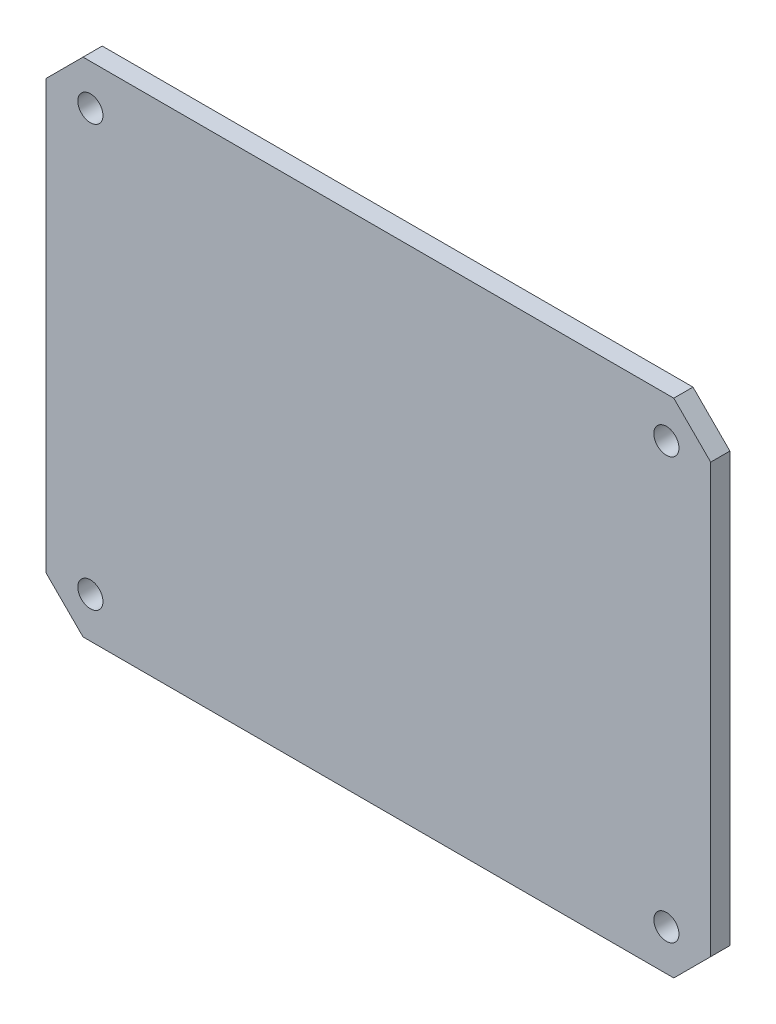
ISO-10303-21;
HEADER;
FILE_DESCRIPTION(('STEP AP214'),'2;1');
FILE_NAME('part.step','',(''),(''),'','','');
FILE_SCHEMA(('AUTOMOTIVE_DESIGN { 1 0 10303 214 1 1 1 1 }'));
ENDSEC;
DATA;
#1=APPLICATION_CONTEXT('core data for automotive mechanical design processes');
#2=APPLICATION_PROTOCOL_DEFINITION('international standard','automotive_design',2000,#1);
#3=PRODUCT_CONTEXT('',#1,'mechanical');
#4=PRODUCT('Part','Part','',(#3));
#5=PRODUCT_RELATED_PRODUCT_CATEGORY('part','',(#4));
#6=PRODUCT_DEFINITION_FORMATION('','',#4);
#7=PRODUCT_DEFINITION_CONTEXT('part definition',#1,'design');
#8=PRODUCT_DEFINITION('design','',#6,#7);
#9=PRODUCT_DEFINITION_SHAPE('','',#8);
#10=(LENGTH_UNIT() NAMED_UNIT(*) SI_UNIT(.MILLI.,.METRE.));
#11=(NAMED_UNIT(*) PLANE_ANGLE_UNIT() SI_UNIT($,.RADIAN.));
#12=(NAMED_UNIT(*) SI_UNIT($,.STERADIAN.) SOLID_ANGLE_UNIT());
#13=UNCERTAINTY_MEASURE_WITH_UNIT(LENGTH_MEASURE(1.E-05),#10,'distance_accuracy_value','');
#14=(GEOMETRIC_REPRESENTATION_CONTEXT(3) GLOBAL_UNCERTAINTY_ASSIGNED_CONTEXT((#13)) GLOBAL_UNIT_ASSIGNED_CONTEXT((#10,
#11,#12)) REPRESENTATION_CONTEXT('',''));
#15=CARTESIAN_POINT('',(0.,0.,0.));
#16=DIRECTION('',(0.,0.,1.));
#17=DIRECTION('',(1.,0.,0.));
#18=AXIS2_PLACEMENT_3D('',#15,#16,#17);
#19=CARTESIAN_POINT('',(0.,0.,2.6));
#20=DIRECTION('',(0.,0.,1.));
#21=DIRECTION('',(1.,0.,0.));
#22=AXIS2_PLACEMENT_3D('',#19,#20,#21);
#23=PLANE('',#22);
#24=CARTESIAN_POINT('',(-39.,28.5,2.6));
#25=DIRECTION('',(0.,0.,1.));
#26=DIRECTION('',(1.,0.,0.));
#27=AXIS2_PLACEMENT_3D('',#24,#25,#26);
#28=CIRCLE('',#27,1.7);
#29=CARTESIAN_POINT('',(-37.3,28.5,2.6));
#30=VERTEX_POINT('',#29);
#31=EDGE_CURVE('E198',#30,#30,#28,.T.);
#32=ORIENTED_EDGE('',*,*,#31,.F.);
#33=EDGE_LOOP('',(#32));
#34=FACE_BOUND('',#33,.T.);
#35=CARTESIAN_POINT('',(-39.,-28.5,2.6));
#36=DIRECTION('',(0.,0.,1.));
#37=DIRECTION('',(1.,0.,0.));
#38=AXIS2_PLACEMENT_3D('',#35,#36,#37);
#39=CIRCLE('',#38,1.7);
#40=CARTESIAN_POINT('',(-37.3,-28.5,2.6));
#41=VERTEX_POINT('',#40);
#42=EDGE_CURVE('E144',#41,#41,#39,.T.);
#43=ORIENTED_EDGE('',*,*,#42,.F.);
#44=EDGE_LOOP('',(#43));
#45=FACE_BOUND('',#44,.T.);
#46=DIRECTION('',(0.707106781186547,-0.707106781186548,0.));
#47=VECTOR('',#46,1.);
#48=CARTESIAN_POINT('',(-45.,-29.,2.6));
#49=LINE('',#48,#47);
#50=CARTESIAN_POINT('',(-45.,-29.,2.6));
#51=VERTEX_POINT('',#50);
#52=CARTESIAN_POINT('',(-40.,-34.,2.6));
#53=VERTEX_POINT('',#52);
#54=EDGE_CURVE('E155',#51,#53,#49,.T.);
#55=ORIENTED_EDGE('',*,*,#54,.T.);
#56=DIRECTION('',(1.,0.,0.));
#57=VECTOR('',#56,1.);
#58=CARTESIAN_POINT('',(-40.,-34.,2.6));
#59=LINE('',#58,#57);
#60=CARTESIAN_POINT('',(40.,-34.,2.6));
#61=VERTEX_POINT('',#60);
#62=EDGE_CURVE('E103',#53,#61,#59,.T.);
#63=ORIENTED_EDGE('',*,*,#62,.T.);
#64=DIRECTION('',(0.707106781186547,0.707106781186548,0.));
#65=VECTOR('',#64,1.);
#66=CARTESIAN_POINT('',(40.,-34.,2.6));
#67=LINE('',#66,#65);
#68=CARTESIAN_POINT('',(45.,-29.,2.6));
#69=VERTEX_POINT('',#68);
#70=EDGE_CURVE('E170',#61,#69,#67,.T.);
#71=ORIENTED_EDGE('',*,*,#70,.T.);
#72=DIRECTION('',(0.,1.,0.));
#73=VECTOR('',#72,1.);
#74=CARTESIAN_POINT('',(45.,-29.,2.6));
#75=LINE('',#74,#73);
#76=CARTESIAN_POINT('',(45.,29.,2.6));
#77=VERTEX_POINT('',#76);
#78=EDGE_CURVE('E183',#69,#77,#75,.T.);
#79=ORIENTED_EDGE('',*,*,#78,.T.);
#80=DIRECTION('',(-0.707106781186547,0.707106781186548,0.));
#81=VECTOR('',#80,1.);
#82=CARTESIAN_POINT('',(45.,29.,2.6));
#83=LINE('',#82,#81);
#84=CARTESIAN_POINT('',(40.,34.,2.6));
#85=VERTEX_POINT('',#84);
#86=EDGE_CURVE('E122',#77,#85,#83,.T.);
#87=ORIENTED_EDGE('',*,*,#86,.T.);
#88=DIRECTION('',(-1.,0.,0.));
#89=VECTOR('',#88,1.);
#90=CARTESIAN_POINT('',(40.,34.,2.6));
#91=LINE('',#90,#89);
#92=CARTESIAN_POINT('',(-40.,34.,2.6));
#93=VERTEX_POINT('',#92);
#94=EDGE_CURVE('E116',#85,#93,#91,.T.);
#95=ORIENTED_EDGE('',*,*,#94,.T.);
#96=DIRECTION('',(-0.707106781186547,-0.707106781186548,0.));
#97=VECTOR('',#96,1.);
#98=CARTESIAN_POINT('',(-40.,34.,2.6));
#99=LINE('',#98,#97);
#100=CARTESIAN_POINT('',(-45.,29.,2.6));
#101=VERTEX_POINT('',#100);
#102=EDGE_CURVE('E120',#93,#101,#99,.T.);
#103=ORIENTED_EDGE('',*,*,#102,.T.);
#104=DIRECTION('',(0.,-1.,0.));
#105=VECTOR('',#104,1.);
#106=CARTESIAN_POINT('',(-45.,29.,2.6));
#107=LINE('',#106,#105);
#108=EDGE_CURVE('E60',#101,#51,#107,.T.);
#109=ORIENTED_EDGE('',*,*,#108,.T.);
#110=EDGE_LOOP('',(#55,#63,#71,#79,#87,#95,#103,#109));
#111=FACE_BOUND('',#110,.T.);
#112=CARTESIAN_POINT('',(39.,-28.5,2.6));
#113=DIRECTION('',(0.,0.,1.));
#114=DIRECTION('',(1.,0.,0.));
#115=AXIS2_PLACEMENT_3D('',#112,#113,#114);
#116=CIRCLE('',#115,1.7);
#117=CARTESIAN_POINT('',(40.7,-28.5,2.6));
#118=VERTEX_POINT('',#117);
#119=EDGE_CURVE('E192',#118,#118,#116,.T.);
#120=ORIENTED_EDGE('',*,*,#119,.F.);
#121=EDGE_LOOP('',(#120));
#122=FACE_BOUND('',#121,.T.);
#123=CARTESIAN_POINT('',(39.,28.5,2.6));
#124=DIRECTION('',(0.,0.,1.));
#125=DIRECTION('',(1.,0.,0.));
#126=AXIS2_PLACEMENT_3D('',#123,#124,#125);
#127=CIRCLE('',#126,1.7);
#128=CARTESIAN_POINT('',(40.7,28.5,2.6));
#129=VERTEX_POINT('',#128);
#130=EDGE_CURVE('E204',#129,#129,#127,.T.);
#131=ORIENTED_EDGE('',*,*,#130,.F.);
#132=EDGE_LOOP('',(#131));
#133=FACE_BOUND('',#132,.T.);
#134=ADVANCED_FACE('F43',(#34,#45,#111,#122,#133),#23,.T.);
#135=CARTESIAN_POINT('',(0.,0.,0.));
#136=DIRECTION('',(0.,0.,1.));
#137=DIRECTION('',(1.,0.,0.));
#138=AXIS2_PLACEMENT_3D('',#135,#136,#137);
#139=PLANE('',#138);
#140=DIRECTION('',(0.707106781186547,-0.707106781186548,0.));
#141=VECTOR('',#140,1.);
#142=CARTESIAN_POINT('',(-45.,-29.,0.));
#143=LINE('',#142,#141);
#144=CARTESIAN_POINT('',(-45.,-29.,0.));
#145=VERTEX_POINT('',#144);
#146=CARTESIAN_POINT('',(-40.,-34.,0.));
#147=VERTEX_POINT('',#146);
#148=EDGE_CURVE('E140',#145,#147,#143,.T.);
#149=ORIENTED_EDGE('',*,*,#148,.F.);
#150=DIRECTION('',(0.,-1.,0.));
#151=VECTOR('',#150,1.);
#152=CARTESIAN_POINT('',(-45.,29.,0.));
#153=LINE('',#152,#151);
#154=CARTESIAN_POINT('',(-45.,29.,0.));
#155=VERTEX_POINT('',#154);
#156=EDGE_CURVE('E95',#155,#145,#153,.T.);
#157=ORIENTED_EDGE('',*,*,#156,.F.);
#158=DIRECTION('',(-0.707106781186547,-0.707106781186548,0.));
#159=VECTOR('',#158,1.);
#160=CARTESIAN_POINT('',(-40.,34.,0.));
#161=LINE('',#160,#159);
#162=CARTESIAN_POINT('',(-40.,34.,0.));
#163=VERTEX_POINT('',#162);
#164=EDGE_CURVE('E89',#163,#155,#161,.T.);
#165=ORIENTED_EDGE('',*,*,#164,.F.);
#166=DIRECTION('',(-1.,0.,0.));
#167=VECTOR('',#166,1.);
#168=CARTESIAN_POINT('',(40.,34.,0.));
#169=LINE('',#168,#167);
#170=CARTESIAN_POINT('',(40.,34.,0.));
#171=VERTEX_POINT('',#170);
#172=EDGE_CURVE('E130',#171,#163,#169,.T.);
#173=ORIENTED_EDGE('',*,*,#172,.F.);
#174=DIRECTION('',(-0.707106781186547,0.707106781186548,0.));
#175=VECTOR('',#174,1.);
#176=CARTESIAN_POINT('',(45.,29.,0.));
#177=LINE('',#176,#175);
#178=CARTESIAN_POINT('',(45.,29.,0.));
#179=VERTEX_POINT('',#178);
#180=EDGE_CURVE('E150',#179,#171,#177,.T.);
#181=ORIENTED_EDGE('',*,*,#180,.F.);
#182=DIRECTION('',(0.,1.,0.));
#183=VECTOR('',#182,1.);
#184=CARTESIAN_POINT('',(45.,-29.,0.));
#185=LINE('',#184,#183);
#186=CARTESIAN_POINT('',(45.,-29.,0.));
#187=VERTEX_POINT('',#186);
#188=EDGE_CURVE('E148',#187,#179,#185,.T.);
#189=ORIENTED_EDGE('',*,*,#188,.F.);
#190=DIRECTION('',(0.707106781186547,0.707106781186548,0.));
#191=VECTOR('',#190,1.);
#192=CARTESIAN_POINT('',(40.,-34.,0.));
#193=LINE('',#192,#191);
#194=CARTESIAN_POINT('',(40.,-34.,0.));
#195=VERTEX_POINT('',#194);
#196=EDGE_CURVE('E146',#195,#187,#193,.T.);
#197=ORIENTED_EDGE('',*,*,#196,.F.);
#198=DIRECTION('',(1.,0.,0.));
#199=VECTOR('',#198,1.);
#200=CARTESIAN_POINT('',(-40.,-34.,0.));
#201=LINE('',#200,#199);
#202=EDGE_CURVE('E143',#147,#195,#201,.T.);
#203=ORIENTED_EDGE('',*,*,#202,.F.);
#204=EDGE_LOOP('',(#149,#157,#165,#173,#181,#189,#197,#203));
#205=FACE_BOUND('',#204,.T.);
#206=CARTESIAN_POINT('',(-39.,-28.5,0.));
#207=DIRECTION('',(0.,0.,1.));
#208=DIRECTION('',(1.,0.,0.));
#209=AXIS2_PLACEMENT_3D('',#206,#207,#208);
#210=CIRCLE('',#209,1.7);
#211=CARTESIAN_POINT('',(-37.3,-28.5,0.));
#212=VERTEX_POINT('',#211);
#213=EDGE_CURVE('E189',#212,#212,#210,.T.);
#214=ORIENTED_EDGE('',*,*,#213,.T.);
#215=EDGE_LOOP('',(#214));
#216=FACE_BOUND('',#215,.T.);
#217=CARTESIAN_POINT('',(39.,-28.5,0.));
#218=DIRECTION('',(0.,0.,1.));
#219=DIRECTION('',(1.,0.,0.));
#220=AXIS2_PLACEMENT_3D('',#217,#218,#219);
#221=CIRCLE('',#220,1.7);
#222=CARTESIAN_POINT('',(40.7,-28.5,0.));
#223=VERTEX_POINT('',#222);
#224=EDGE_CURVE('E195',#223,#223,#221,.T.);
#225=ORIENTED_EDGE('',*,*,#224,.T.);
#226=EDGE_LOOP('',(#225));
#227=FACE_BOUND('',#226,.T.);
#228=CARTESIAN_POINT('',(-39.,28.5,0.));
#229=DIRECTION('',(0.,0.,1.));
#230=DIRECTION('',(1.,0.,0.));
#231=AXIS2_PLACEMENT_3D('',#228,#229,#230);
#232=CIRCLE('',#231,1.7);
#233=CARTESIAN_POINT('',(-37.3,28.5,0.));
#234=VERTEX_POINT('',#233);
#235=EDGE_CURVE('E201',#234,#234,#232,.T.);
#236=ORIENTED_EDGE('',*,*,#235,.T.);
#237=EDGE_LOOP('',(#236));
#238=FACE_BOUND('',#237,.T.);
#239=CARTESIAN_POINT('',(39.,28.5,0.));
#240=DIRECTION('',(0.,0.,1.));
#241=DIRECTION('',(1.,0.,0.));
#242=AXIS2_PLACEMENT_3D('',#239,#240,#241);
#243=CIRCLE('',#242,1.7);
#244=CARTESIAN_POINT('',(40.7,28.5,0.));
#245=VERTEX_POINT('',#244);
#246=EDGE_CURVE('E207',#245,#245,#243,.T.);
#247=ORIENTED_EDGE('',*,*,#246,.T.);
#248=EDGE_LOOP('',(#247));
#249=FACE_BOUND('',#248,.T.);
#250=ADVANCED_FACE('F174',(#205,#216,#227,#238,#249),#139,.F.);
#251=CARTESIAN_POINT('',(-45.,-29.,2.6));
#252=DIRECTION('',(0.707106781186548,0.707106781186547,0.));
#253=DIRECTION('',(-0.707106781186547,0.707106781186548,0.));
#254=AXIS2_PLACEMENT_3D('',#251,#252,#253);
#255=PLANE('',#254);
#256=ORIENTED_EDGE('',*,*,#148,.T.);
#257=DIRECTION('',(0.,0.,-1.));
#258=VECTOR('',#257,1.);
#259=CARTESIAN_POINT('',(-40.,-34.,2.6));
#260=LINE('',#259,#258);
#261=EDGE_CURVE('E11',#53,#147,#260,.T.);
#262=ORIENTED_EDGE('',*,*,#261,.F.);
#263=ORIENTED_EDGE('',*,*,#54,.F.);
#264=DIRECTION('',(0.,0.,-1.));
#265=VECTOR('',#264,1.);
#266=CARTESIAN_POINT('',(-45.,-29.,2.6));
#267=LINE('',#266,#265);
#268=EDGE_CURVE('E136',#51,#145,#267,.T.);
#269=ORIENTED_EDGE('',*,*,#268,.T.);
#270=EDGE_LOOP('',(#256,#262,#263,#269));
#271=FACE_BOUND('',#270,.T.);
#272=ADVANCED_FACE('F45',(#271),#255,.F.);
#273=CARTESIAN_POINT('',(-40.,-34.,2.6));
#274=DIRECTION('',(0.,1.,0.));
#275=DIRECTION('',(0.,0.,1.));
#276=AXIS2_PLACEMENT_3D('',#273,#274,#275);
#277=PLANE('',#276);
#278=ORIENTED_EDGE('',*,*,#202,.T.);
#279=DIRECTION('',(0.,0.,-1.));
#280=VECTOR('',#279,1.);
#281=CARTESIAN_POINT('',(40.,-34.,2.6));
#282=LINE('',#281,#280);
#283=EDGE_CURVE('E52',#61,#195,#282,.T.);
#284=ORIENTED_EDGE('',*,*,#283,.F.);
#285=ORIENTED_EDGE('',*,*,#62,.F.);
#286=ORIENTED_EDGE('',*,*,#261,.T.);
#287=EDGE_LOOP('',(#278,#284,#285,#286));
#288=FACE_BOUND('',#287,.T.);
#289=ADVANCED_FACE('F241',(#288),#277,.F.);
#290=CARTESIAN_POINT('',(40.,-34.,2.6));
#291=DIRECTION('',(-0.707106781186548,0.707106781186547,0.));
#292=DIRECTION('',(-0.707106781186547,-0.707106781186548,0.));
#293=AXIS2_PLACEMENT_3D('',#290,#291,#292);
#294=PLANE('',#293);
#295=ORIENTED_EDGE('',*,*,#196,.T.);
#296=DIRECTION('',(0.,0.,-1.));
#297=VECTOR('',#296,1.);
#298=CARTESIAN_POINT('',(45.,-29.,2.6));
#299=LINE('',#298,#297);
#300=EDGE_CURVE('E162',#69,#187,#299,.T.);
#301=ORIENTED_EDGE('',*,*,#300,.F.);
#302=ORIENTED_EDGE('',*,*,#70,.F.);
#303=ORIENTED_EDGE('',*,*,#283,.T.);
#304=EDGE_LOOP('',(#295,#301,#302,#303));
#305=FACE_BOUND('',#304,.T.);
#306=ADVANCED_FACE('F168',(#305),#294,.F.);
#307=CARTESIAN_POINT('',(45.,-29.,2.6));
#308=DIRECTION('',(-1.,0.,0.));
#309=DIRECTION('',(0.,0.,1.));
#310=AXIS2_PLACEMENT_3D('',#307,#308,#309);
#311=PLANE('',#310);
#312=ORIENTED_EDGE('',*,*,#188,.T.);
#313=DIRECTION('',(0.,0.,-1.));
#314=VECTOR('',#313,1.);
#315=CARTESIAN_POINT('',(45.,29.,2.6));
#316=LINE('',#315,#314);
#317=EDGE_CURVE('E159',#77,#179,#316,.T.);
#318=ORIENTED_EDGE('',*,*,#317,.F.);
#319=ORIENTED_EDGE('',*,*,#78,.F.);
#320=ORIENTED_EDGE('',*,*,#300,.T.);
#321=EDGE_LOOP('',(#312,#318,#319,#320));
#322=FACE_BOUND('',#321,.T.);
#323=ADVANCED_FACE('F179',(#322),#311,.F.);
#324=CARTESIAN_POINT('',(45.,29.,2.6));
#325=DIRECTION('',(-0.707106781186548,-0.707106781186547,0.));
#326=DIRECTION('',(0.707106781186547,-0.707106781186548,0.));
#327=AXIS2_PLACEMENT_3D('',#324,#325,#326);
#328=PLANE('',#327);
#329=ORIENTED_EDGE('',*,*,#180,.T.);
#330=DIRECTION('',(0.,0.,-1.));
#331=VECTOR('',#330,1.);
#332=CARTESIAN_POINT('',(40.,34.,2.6));
#333=LINE('',#332,#331);
#334=EDGE_CURVE('E131',#85,#171,#333,.T.);
#335=ORIENTED_EDGE('',*,*,#334,.F.);
#336=ORIENTED_EDGE('',*,*,#86,.F.);
#337=ORIENTED_EDGE('',*,*,#317,.T.);
#338=EDGE_LOOP('',(#329,#335,#336,#337));
#339=FACE_BOUND('',#338,.T.);
#340=ADVANCED_FACE('F182',(#339),#328,.F.);
#341=CARTESIAN_POINT('',(40.,34.,2.6));
#342=DIRECTION('',(0.,-1.,0.));
#343=DIRECTION('',(0.,0.,-1.));
#344=AXIS2_PLACEMENT_3D('',#341,#342,#343);
#345=PLANE('',#344);
#346=ORIENTED_EDGE('',*,*,#172,.T.);
#347=DIRECTION('',(0.,0.,-1.));
#348=VECTOR('',#347,1.);
#349=CARTESIAN_POINT('',(-40.,34.,2.6));
#350=LINE('',#349,#348);
#351=EDGE_CURVE('E127',#93,#163,#350,.T.);
#352=ORIENTED_EDGE('',*,*,#351,.F.);
#353=ORIENTED_EDGE('',*,*,#94,.F.);
#354=ORIENTED_EDGE('',*,*,#334,.T.);
#355=EDGE_LOOP('',(#346,#352,#353,#354));
#356=FACE_BOUND('',#355,.T.);
#357=ADVANCED_FACE('F128',(#356),#345,.F.);
#358=CARTESIAN_POINT('',(-40.,34.,2.6));
#359=DIRECTION('',(0.707106781186548,-0.707106781186547,0.));
#360=DIRECTION('',(0.707106781186547,0.707106781186548,0.));
#361=AXIS2_PLACEMENT_3D('',#358,#359,#360);
#362=PLANE('',#361);
#363=ORIENTED_EDGE('',*,*,#164,.T.);
#364=DIRECTION('',(0.,0.,-1.));
#365=VECTOR('',#364,1.);
#366=CARTESIAN_POINT('',(-45.,29.,2.6));
#367=LINE('',#366,#365);
#368=EDGE_CURVE('E132',#101,#155,#367,.T.);
#369=ORIENTED_EDGE('',*,*,#368,.F.);
#370=ORIENTED_EDGE('',*,*,#102,.F.);
#371=ORIENTED_EDGE('',*,*,#351,.T.);
#372=EDGE_LOOP('',(#363,#369,#370,#371));
#373=FACE_BOUND('',#372,.T.);
#374=ADVANCED_FACE('F134',(#373),#362,.F.);
#375=CARTESIAN_POINT('',(-45.,29.,2.6));
#376=DIRECTION('',(1.,0.,0.));
#377=DIRECTION('',(0.,0.,-1.));
#378=AXIS2_PLACEMENT_3D('',#375,#376,#377);
#379=PLANE('',#378);
#380=ORIENTED_EDGE('',*,*,#156,.T.);
#381=ORIENTED_EDGE('',*,*,#268,.F.);
#382=ORIENTED_EDGE('',*,*,#108,.F.);
#383=ORIENTED_EDGE('',*,*,#368,.T.);
#384=EDGE_LOOP('',(#380,#381,#382,#383));
#385=FACE_BOUND('',#384,.T.);
#386=ADVANCED_FACE('F229',(#385),#379,.F.);
#387=CARTESIAN_POINT('',(-39.,-28.5,2.6));
#388=DIRECTION('',(0.,0.,-1.));
#389=DIRECTION('',(-1.,0.,0.));
#390=AXIS2_PLACEMENT_3D('',#387,#388,#389);
#391=CYLINDRICAL_SURFACE('',#390,1.7);
#392=ORIENTED_EDGE('',*,*,#42,.T.);
#393=EDGE_LOOP('',(#392));
#394=FACE_BOUND('',#393,.T.);
#395=ORIENTED_EDGE('',*,*,#213,.F.);
#396=EDGE_LOOP('',(#395));
#397=FACE_BOUND('',#396,.T.);
#398=ADVANCED_FACE('F226',(#394,#397),#391,.F.);
#399=CARTESIAN_POINT('',(39.,-28.5,2.6));
#400=DIRECTION('',(0.,0.,-1.));
#401=DIRECTION('',(-1.,0.,0.));
#402=AXIS2_PLACEMENT_3D('',#399,#400,#401);
#403=CYLINDRICAL_SURFACE('',#402,1.7);
#404=ORIENTED_EDGE('',*,*,#119,.T.);
#405=EDGE_LOOP('',(#404));
#406=FACE_BOUND('',#405,.T.);
#407=ORIENTED_EDGE('',*,*,#224,.F.);
#408=EDGE_LOOP('',(#407));
#409=FACE_BOUND('',#408,.T.);
#410=ADVANCED_FACE('F304',(#406,#409),#403,.F.);
#411=CARTESIAN_POINT('',(-39.,28.5,2.6));
#412=DIRECTION('',(0.,0.,-1.));
#413=DIRECTION('',(-1.,0.,0.));
#414=AXIS2_PLACEMENT_3D('',#411,#412,#413);
#415=CYLINDRICAL_SURFACE('',#414,1.7);
#416=ORIENTED_EDGE('',*,*,#31,.T.);
#417=EDGE_LOOP('',(#416));
#418=FACE_BOUND('',#417,.T.);
#419=ORIENTED_EDGE('',*,*,#235,.F.);
#420=EDGE_LOOP('',(#419));
#421=FACE_BOUND('',#420,.T.);
#422=ADVANCED_FACE('F312',(#418,#421),#415,.F.);
#423=CARTESIAN_POINT('',(39.,28.5,2.6));
#424=DIRECTION('',(0.,0.,-1.));
#425=DIRECTION('',(-1.,0.,0.));
#426=AXIS2_PLACEMENT_3D('',#423,#424,#425);
#427=CYLINDRICAL_SURFACE('',#426,1.7);
#428=ORIENTED_EDGE('',*,*,#130,.T.);
#429=EDGE_LOOP('',(#428));
#430=FACE_BOUND('',#429,.T.);
#431=ORIENTED_EDGE('',*,*,#246,.F.);
#432=EDGE_LOOP('',(#431));
#433=FACE_BOUND('',#432,.T.);
#434=ADVANCED_FACE('F213',(#430,#433),#427,.F.);
#435=CLOSED_SHELL('',(#134,#250,#272,#289,#306,#323,#340,#357,#374,#386,#398,#410,#422,#434));
#436=MANIFOLD_SOLID_BREP('B2',#435);
#437=ADVANCED_BREP_SHAPE_REPRESENTATION('',(#18,#436),#14);
#438=SHAPE_DEFINITION_REPRESENTATION(#9,#437);
ENDSEC;
END-ISO-10303-21;
